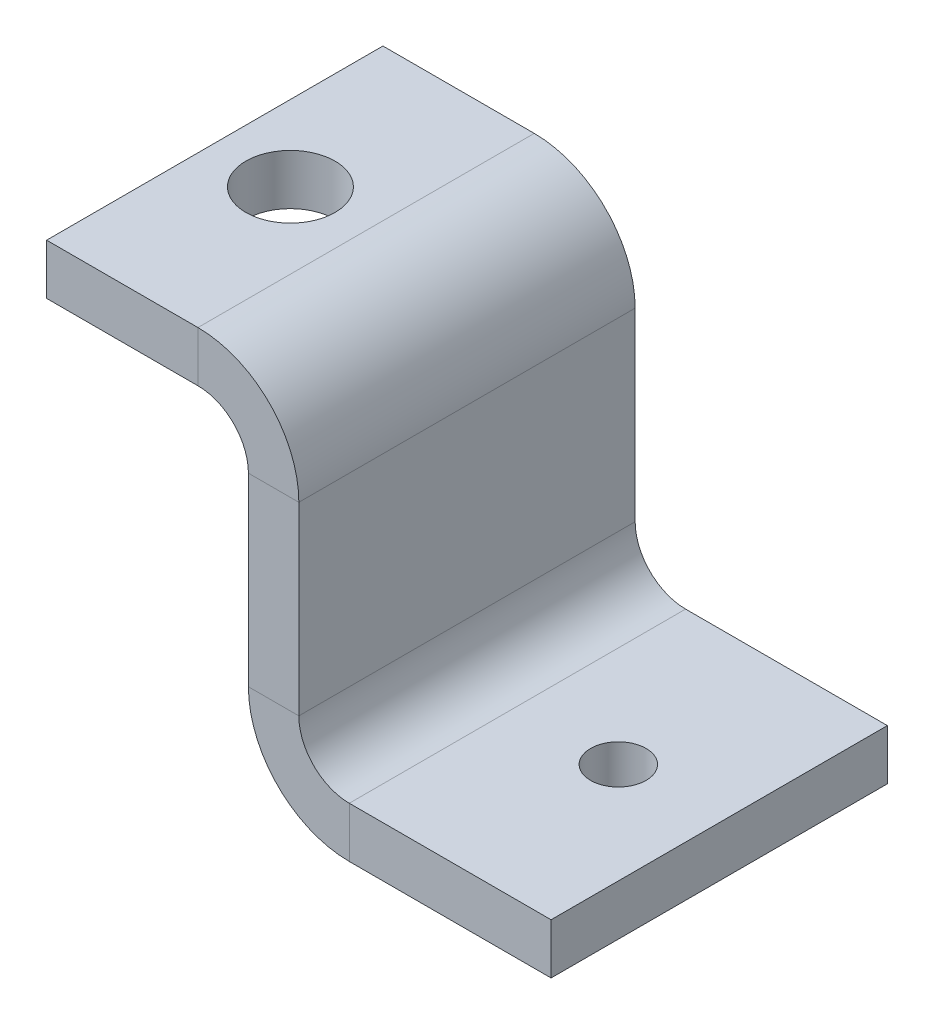
ISO-10303-21;
HEADER;
FILE_DESCRIPTION(('STEP AP214'),'2;1');
FILE_NAME('part.step','',(''),(''),'','','');
FILE_SCHEMA(('AUTOMOTIVE_DESIGN { 1 0 10303 214 1 1 1 1 }'));
ENDSEC;
DATA;
#1=APPLICATION_CONTEXT('core data for automotive mechanical design processes');
#2=APPLICATION_PROTOCOL_DEFINITION('international standard','automotive_design',2000,#1);
#3=PRODUCT_CONTEXT('',#1,'mechanical');
#4=PRODUCT('Part','Part','',(#3));
#5=PRODUCT_RELATED_PRODUCT_CATEGORY('part','',(#4));
#6=PRODUCT_DEFINITION_FORMATION('','',#4);
#7=PRODUCT_DEFINITION_CONTEXT('part definition',#1,'design');
#8=PRODUCT_DEFINITION('design','',#6,#7);
#9=PRODUCT_DEFINITION_SHAPE('','',#8);
#10=(LENGTH_UNIT() NAMED_UNIT(*) SI_UNIT(.MILLI.,.METRE.));
#11=(NAMED_UNIT(*) PLANE_ANGLE_UNIT() SI_UNIT($,.RADIAN.));
#12=(NAMED_UNIT(*) SI_UNIT($,.STERADIAN.) SOLID_ANGLE_UNIT());
#13=UNCERTAINTY_MEASURE_WITH_UNIT(LENGTH_MEASURE(1.E-05),#10,'distance_accuracy_value','');
#14=(GEOMETRIC_REPRESENTATION_CONTEXT(3) GLOBAL_UNCERTAINTY_ASSIGNED_CONTEXT((#13)) GLOBAL_UNIT_ASSIGNED_CONTEXT((#10,
#11,#12)) REPRESENTATION_CONTEXT('',''));
#15=CARTESIAN_POINT('',(0.,0.,0.));
#16=DIRECTION('',(0.,0.,1.));
#17=DIRECTION('',(1.,0.,0.));
#18=AXIS2_PLACEMENT_3D('',#15,#16,#17);
#19=CARTESIAN_POINT('',(-0.568720379146924,14.,20.));
#20=DIRECTION('',(0.,0.,1.));
#21=DIRECTION('',(1.,0.,0.));
#22=AXIS2_PLACEMENT_3D('',#19,#20,#21);
#23=PLANE('',#22);
#24=DIRECTION('',(-1.,0.,0.));
#25=VECTOR('',#24,1.);
#26=CARTESIAN_POINT('',(-0.568720379146924,14.,20.));
#27=LINE('',#26,#25);
#28=CARTESIAN_POINT('',(-0.568720379146924,14.,20.));
#29=VERTEX_POINT('',#28);
#30=CARTESIAN_POINT('',(-3.56872037914692,14.,20.));
#31=VERTEX_POINT('',#30);
#32=EDGE_CURVE('E11',#29,#31,#27,.T.);
#33=ORIENTED_EDGE('',*,*,#32,.F.);
#34=CARTESIAN_POINT('',(-6.56872037914692,14.,20.));
#35=DIRECTION('',(0.,0.,1.));
#36=DIRECTION('',(1.,0.,0.));
#37=AXIS2_PLACEMENT_3D('',#34,#35,#36);
#38=CIRCLE('',#37,6.);
#39=CARTESIAN_POINT('',(-6.56872037914692,20.,20.));
#40=VERTEX_POINT('',#39);
#41=EDGE_CURVE('E288',#40,#29,#38,.F.);
#42=ORIENTED_EDGE('',*,*,#41,.F.);
#43=DIRECTION('',(0.,1.,0.));
#44=VECTOR('',#43,1.);
#45=CARTESIAN_POINT('',(-6.56872037914692,17.,20.));
#46=LINE('',#45,#44);
#47=CARTESIAN_POINT('',(-6.56872037914692,17.,20.));
#48=VERTEX_POINT('',#47);
#49=EDGE_CURVE('E50',#48,#40,#46,.T.);
#50=ORIENTED_EDGE('',*,*,#49,.F.);
#51=CARTESIAN_POINT('',(-6.56872037914692,14.,20.));
#52=DIRECTION('',(0.,0.,1.));
#53=DIRECTION('',(1.,0.,0.));
#54=AXIS2_PLACEMENT_3D('',#51,#52,#53);
#55=CIRCLE('',#54,3.);
#56=EDGE_CURVE('E151',#48,#31,#55,.F.);
#57=ORIENTED_EDGE('',*,*,#56,.T.);
#58=EDGE_LOOP('',(#33,#42,#50,#57));
#59=FACE_BOUND('',#58,.T.);
#60=ADVANCED_FACE('F40',(#59),#23,.T.);
#61=CARTESIAN_POINT('',(-6.56872037914692,17.,20.));
#62=DIRECTION('',(0.,0.,1.));
#63=DIRECTION('',(1.,0.,0.));
#64=AXIS2_PLACEMENT_3D('',#61,#62,#63);
#65=PLANE('',#64);
#66=DIRECTION('',(0.,-1.,0.));
#67=VECTOR('',#66,1.);
#68=CARTESIAN_POINT('',(-0.568720379146924,20.,20.));
#69=LINE('',#68,#67);
#70=CARTESIAN_POINT('',(-0.568720379146922,3.,20.));
#71=VERTEX_POINT('',#70);
#72=EDGE_CURVE('E145',#29,#71,#69,.T.);
#73=ORIENTED_EDGE('',*,*,#72,.F.);
#74=ORIENTED_EDGE('',*,*,#32,.T.);
#75=DIRECTION('',(0.,-1.,0.));
#76=VECTOR('',#75,1.);
#77=CARTESIAN_POINT('',(-3.56872037914692,20.,20.));
#78=LINE('',#77,#76);
#79=CARTESIAN_POINT('',(-3.56872037914692,3.,20.));
#80=VERTEX_POINT('',#79);
#81=EDGE_CURVE('E142',#31,#80,#78,.T.);
#82=ORIENTED_EDGE('',*,*,#81,.T.);
#83=DIRECTION('',(1.,0.,0.));
#84=VECTOR('',#83,1.);
#85=CARTESIAN_POINT('',(-3.56872037914692,3.,20.));
#86=LINE('',#85,#84);
#87=EDGE_CURVE('E262',#80,#71,#86,.T.);
#88=ORIENTED_EDGE('',*,*,#87,.T.);
#89=EDGE_LOOP('',(#73,#74,#82,#88));
#90=FACE_BOUND('',#89,.T.);
#91=ADVANCED_FACE('F140',(#90),#65,.T.);
#92=CARTESIAN_POINT('',(-6.56872037914692,20.,0.));
#93=DIRECTION('',(0.,0.,-1.));
#94=DIRECTION('',(-1.,0.,0.));
#95=AXIS2_PLACEMENT_3D('',#92,#93,#94);
#96=PLANE('',#95);
#97=DIRECTION('',(0.,-1.,0.));
#98=VECTOR('',#97,1.);
#99=CARTESIAN_POINT('',(-6.56872037914692,20.,0.));
#100=LINE('',#99,#98);
#101=CARTESIAN_POINT('',(-6.56872037914692,20.,0.));
#102=VERTEX_POINT('',#101);
#103=CARTESIAN_POINT('',(-6.56872037914692,17.,0.));
#104=VERTEX_POINT('',#103);
#105=EDGE_CURVE('E270',#102,#104,#100,.T.);
#106=ORIENTED_EDGE('',*,*,#105,.F.);
#107=CARTESIAN_POINT('',(-6.56872037914692,14.,0.));
#108=DIRECTION('',(0.,0.,1.));
#109=DIRECTION('',(1.,0.,0.));
#110=AXIS2_PLACEMENT_3D('',#107,#108,#109);
#111=CIRCLE('',#110,6.);
#112=CARTESIAN_POINT('',(-0.568720379146924,14.,0.));
#113=VERTEX_POINT('',#112);
#114=EDGE_CURVE('E200',#102,#113,#111,.F.);
#115=ORIENTED_EDGE('',*,*,#114,.T.);
#116=DIRECTION('',(1.,0.,0.));
#117=VECTOR('',#116,1.);
#118=CARTESIAN_POINT('',(-3.56872037914692,14.,0.));
#119=LINE('',#118,#117);
#120=CARTESIAN_POINT('',(-3.56872037914692,14.,0.));
#121=VERTEX_POINT('',#120);
#122=EDGE_CURVE('E267',#121,#113,#119,.T.);
#123=ORIENTED_EDGE('',*,*,#122,.F.);
#124=CARTESIAN_POINT('',(-6.56872037914692,14.,0.));
#125=DIRECTION('',(0.,0.,1.));
#126=DIRECTION('',(1.,0.,0.));
#127=AXIS2_PLACEMENT_3D('',#124,#125,#126);
#128=CIRCLE('',#127,3.);
#129=EDGE_CURVE('E164',#104,#121,#128,.F.);
#130=ORIENTED_EDGE('',*,*,#129,.F.);
#131=EDGE_LOOP('',(#106,#115,#123,#130));
#132=FACE_BOUND('',#131,.T.);
#133=ADVANCED_FACE('F352',(#132),#96,.T.);
#134=CARTESIAN_POINT('',(-3.56872037914692,14.,0.));
#135=DIRECTION('',(0.,0.,-1.));
#136=DIRECTION('',(-1.,0.,0.));
#137=AXIS2_PLACEMENT_3D('',#134,#135,#136);
#138=PLANE('',#137);
#139=DIRECTION('',(1.,0.,0.));
#140=VECTOR('',#139,1.);
#141=CARTESIAN_POINT('',(-15.5687203791469,20.,0.));
#142=LINE('',#141,#140);
#143=CARTESIAN_POINT('',(-15.5687203791469,20.,0.));
#144=VERTEX_POINT('',#143);
#145=EDGE_CURVE('E203',#144,#102,#142,.T.);
#146=ORIENTED_EDGE('',*,*,#145,.T.);
#147=ORIENTED_EDGE('',*,*,#105,.T.);
#148=DIRECTION('',(1.,0.,0.));
#149=VECTOR('',#148,1.);
#150=CARTESIAN_POINT('',(-15.5687203791469,17.,0.));
#151=LINE('',#150,#149);
#152=CARTESIAN_POINT('',(-15.5687203791469,17.,0.));
#153=VERTEX_POINT('',#152);
#154=EDGE_CURVE('E211',#153,#104,#151,.T.);
#155=ORIENTED_EDGE('',*,*,#154,.F.);
#156=DIRECTION('',(0.,1.,0.));
#157=VECTOR('',#156,1.);
#158=CARTESIAN_POINT('',(-15.5687203791469,17.,0.));
#159=LINE('',#158,#157);
#160=EDGE_CURVE('E207',#153,#144,#159,.T.);
#161=ORIENTED_EDGE('',*,*,#160,.T.);
#162=EDGE_LOOP('',(#146,#147,#155,#161));
#163=FACE_BOUND('',#162,.T.);
#164=ADVANCED_FACE('F355',(#163),#138,.T.);
#165=CARTESIAN_POINT('',(2.43127962085308,0.,20.));
#166=DIRECTION('',(0.,0.,1.));
#167=DIRECTION('',(1.,0.,0.));
#168=AXIS2_PLACEMENT_3D('',#165,#166,#167);
#169=PLANE('',#168);
#170=DIRECTION('',(0.,-1.,0.));
#171=VECTOR('',#170,1.);
#172=CARTESIAN_POINT('',(2.43127962085308,0.,20.));
#173=LINE('',#172,#171);
#174=CARTESIAN_POINT('',(2.43127962085308,0.,20.));
#175=VERTEX_POINT('',#174);
#176=CARTESIAN_POINT('',(2.43127962085308,-3.,20.));
#177=VERTEX_POINT('',#176);
#178=EDGE_CURVE('E58',#175,#177,#173,.T.);
#179=ORIENTED_EDGE('',*,*,#178,.F.);
#180=CARTESIAN_POINT('',(2.43127962085308,3.,20.));
#181=DIRECTION('',(0.,0.,-1.));
#182=DIRECTION('',(-1.,0.,0.));
#183=AXIS2_PLACEMENT_3D('',#180,#181,#182);
#184=CIRCLE('',#183,3.);
#185=EDGE_CURVE('E301',#71,#175,#184,.F.);
#186=ORIENTED_EDGE('',*,*,#185,.F.);
#187=ORIENTED_EDGE('',*,*,#87,.F.);
#188=CARTESIAN_POINT('',(2.43127962085308,3.,20.));
#189=DIRECTION('',(0.,0.,1.));
#190=DIRECTION('',(1.,0.,0.));
#191=AXIS2_PLACEMENT_3D('',#188,#189,#190);
#192=CIRCLE('',#191,6.);
#193=EDGE_CURVE('E174',#80,#177,#192,.T.);
#194=ORIENTED_EDGE('',*,*,#193,.T.);
#195=EDGE_LOOP('',(#179,#186,#187,#194));
#196=FACE_BOUND('',#195,.T.);
#197=ADVANCED_FACE('F382',(#196),#169,.T.);
#198=CARTESIAN_POINT('',(-3.56872037914692,3.,20.));
#199=DIRECTION('',(0.,0.,1.));
#200=DIRECTION('',(1.,0.,0.));
#201=AXIS2_PLACEMENT_3D('',#198,#199,#200);
#202=PLANE('',#201);
#203=DIRECTION('',(1.,0.,0.));
#204=VECTOR('',#203,1.);
#205=CARTESIAN_POINT('',(-0.568720379146922,0.,20.));
#206=LINE('',#205,#204);
#207=CARTESIAN_POINT('',(14.4312796208531,0.,20.));
#208=VERTEX_POINT('',#207);
#209=EDGE_CURVE('E303',#175,#208,#206,.T.);
#210=ORIENTED_EDGE('',*,*,#209,.F.);
#211=ORIENTED_EDGE('',*,*,#178,.T.);
#212=DIRECTION('',(1.,0.,0.));
#213=VECTOR('',#212,1.);
#214=CARTESIAN_POINT('',(-0.568720379146922,-3.,20.));
#215=LINE('',#214,#213);
#216=CARTESIAN_POINT('',(14.4312796208531,-3.,20.));
#217=VERTEX_POINT('',#216);
#218=EDGE_CURVE('E112',#177,#217,#215,.T.);
#219=ORIENTED_EDGE('',*,*,#218,.T.);
#220=DIRECTION('',(0.,-1.,0.));
#221=VECTOR('',#220,1.);
#222=CARTESIAN_POINT('',(14.4312796208531,0.,20.));
#223=LINE('',#222,#221);
#224=EDGE_CURVE('E311',#208,#217,#223,.T.);
#225=ORIENTED_EDGE('',*,*,#224,.F.);
#226=EDGE_LOOP('',(#210,#211,#219,#225));
#227=FACE_BOUND('',#226,.T.);
#228=ADVANCED_FACE('F385',(#227),#202,.T.);
#229=CARTESIAN_POINT('',(-0.568720379146922,3.,0.));
#230=DIRECTION('',(0.,0.,-1.));
#231=DIRECTION('',(-1.,0.,0.));
#232=AXIS2_PLACEMENT_3D('',#229,#230,#231);
#233=PLANE('',#232);
#234=DIRECTION('',(-1.,0.,0.));
#235=VECTOR('',#234,1.);
#236=CARTESIAN_POINT('',(-0.568720379146922,3.,0.));
#237=LINE('',#236,#235);
#238=CARTESIAN_POINT('',(-0.568720379146922,3.,0.));
#239=VERTEX_POINT('',#238);
#240=CARTESIAN_POINT('',(-3.56872037914692,3.,0.));
#241=VERTEX_POINT('',#240);
#242=EDGE_CURVE('E99',#239,#241,#237,.T.);
#243=ORIENTED_EDGE('',*,*,#242,.F.);
#244=CARTESIAN_POINT('',(2.43127962085308,3.,0.));
#245=DIRECTION('',(0.,0.,-1.));
#246=DIRECTION('',(-1.,0.,0.));
#247=AXIS2_PLACEMENT_3D('',#244,#245,#246);
#248=CIRCLE('',#247,3.);
#249=CARTESIAN_POINT('',(2.43127962085308,0.,0.));
#250=VERTEX_POINT('',#249);
#251=EDGE_CURVE('E194',#239,#250,#248,.F.);
#252=ORIENTED_EDGE('',*,*,#251,.T.);
#253=DIRECTION('',(0.,1.,0.));
#254=VECTOR('',#253,1.);
#255=CARTESIAN_POINT('',(2.43127962085308,-3.,0.));
#256=LINE('',#255,#254);
#257=CARTESIAN_POINT('',(2.43127962085308,-3.,0.));
#258=VERTEX_POINT('',#257);
#259=EDGE_CURVE('E106',#258,#250,#256,.T.);
#260=ORIENTED_EDGE('',*,*,#259,.F.);
#261=CARTESIAN_POINT('',(2.43127962085308,3.,0.));
#262=DIRECTION('',(0.,0.,1.));
#263=DIRECTION('',(1.,0.,0.));
#264=AXIS2_PLACEMENT_3D('',#261,#262,#263);
#265=CIRCLE('',#264,6.);
#266=EDGE_CURVE('E220',#241,#258,#265,.T.);
#267=ORIENTED_EDGE('',*,*,#266,.F.);
#268=EDGE_LOOP('',(#243,#252,#260,#267));
#269=FACE_BOUND('',#268,.T.);
#270=ADVANCED_FACE('F346',(#269),#233,.T.);
#271=CARTESIAN_POINT('',(2.43127962085308,-3.,0.));
#272=DIRECTION('',(0.,0.,-1.));
#273=DIRECTION('',(-1.,0.,0.));
#274=AXIS2_PLACEMENT_3D('',#271,#272,#273);
#275=PLANE('',#274);
#276=DIRECTION('',(0.,-1.,0.));
#277=VECTOR('',#276,1.);
#278=CARTESIAN_POINT('',(-0.568720379146924,20.,0.));
#279=LINE('',#278,#277);
#280=EDGE_CURVE('E197',#113,#239,#279,.T.);
#281=ORIENTED_EDGE('',*,*,#280,.T.);
#282=ORIENTED_EDGE('',*,*,#242,.T.);
#283=DIRECTION('',(0.,-1.,0.));
#284=VECTOR('',#283,1.);
#285=CARTESIAN_POINT('',(-3.56872037914692,20.,0.));
#286=LINE('',#285,#284);
#287=EDGE_CURVE('E217',#121,#241,#286,.T.);
#288=ORIENTED_EDGE('',*,*,#287,.F.);
#289=ORIENTED_EDGE('',*,*,#122,.T.);
#290=EDGE_LOOP('',(#281,#282,#288,#289));
#291=FACE_BOUND('',#290,.T.);
#292=ADVANCED_FACE('F348',(#291),#275,.T.);
#293=CARTESIAN_POINT('',(-0.568720379146922,-3.,20.));
#294=DIRECTION('',(0.,1.,0.));
#295=DIRECTION('',(0.,0.,1.));
#296=AXIS2_PLACEMENT_3D('',#293,#294,#295);
#297=PLANE('',#296);
#298=CARTESIAN_POINT('',(8.43127962085308,-3.,10.));
#299=DIRECTION('',(0.,1.,0.));
#300=DIRECTION('',(0.,0.,1.));
#301=AXIS2_PLACEMENT_3D('',#298,#299,#300);
#302=CIRCLE('',#301,1.65);
#303=CARTESIAN_POINT('',(8.43127962085308,-3.,11.65));
#304=VERTEX_POINT('',#303);
#305=EDGE_CURVE('E323',#304,#304,#302,.T.);
#306=ORIENTED_EDGE('',*,*,#305,.T.);
#307=EDGE_LOOP('',(#306));
#308=FACE_BOUND('',#307,.T.);
#309=DIRECTION('',(1.,0.,0.));
#310=VECTOR('',#309,1.);
#311=CARTESIAN_POINT('',(-0.568720379146922,-3.,0.));
#312=LINE('',#311,#310);
#313=CARTESIAN_POINT('',(14.4312796208531,-3.,0.));
#314=VERTEX_POINT('',#313);
#315=EDGE_CURVE('E182',#258,#314,#312,.T.);
#316=ORIENTED_EDGE('',*,*,#315,.T.);
#317=DIRECTION('',(0.,0.,-1.));
#318=VECTOR('',#317,1.);
#319=CARTESIAN_POINT('',(14.4312796208531,-3.,20.));
#320=LINE('',#319,#318);
#321=EDGE_CURVE('E255',#217,#314,#320,.T.);
#322=ORIENTED_EDGE('',*,*,#321,.F.);
#323=ORIENTED_EDGE('',*,*,#218,.F.);
#324=DIRECTION('',(0.,0.,-1.));
#325=VECTOR('',#324,1.);
#326=CARTESIAN_POINT('',(2.43127962085308,-3.,20.));
#327=LINE('',#326,#325);
#328=EDGE_CURVE('E178',#177,#258,#327,.T.);
#329=ORIENTED_EDGE('',*,*,#328,.T.);
#330=EDGE_LOOP('',(#316,#322,#323,#329));
#331=FACE_BOUND('',#330,.T.);
#332=ADVANCED_FACE('F393',(#308,#331),#297,.F.);
#333=CARTESIAN_POINT('',(14.4312796208531,0.,20.));
#334=DIRECTION('',(1.,0.,0.));
#335=DIRECTION('',(0.,0.,-1.));
#336=AXIS2_PLACEMENT_3D('',#333,#334,#335);
#337=PLANE('',#336);
#338=DIRECTION('',(0.,-1.,0.));
#339=VECTOR('',#338,1.);
#340=CARTESIAN_POINT('',(14.4312796208531,0.,0.));
#341=LINE('',#340,#339);
#342=CARTESIAN_POINT('',(14.4312796208531,0.,0.));
#343=VERTEX_POINT('',#342);
#344=EDGE_CURVE('E186',#343,#314,#341,.T.);
#345=ORIENTED_EDGE('',*,*,#344,.F.);
#346=DIRECTION('',(0.,0.,-1.));
#347=VECTOR('',#346,1.);
#348=CARTESIAN_POINT('',(14.4312796208531,0.,20.));
#349=LINE('',#348,#347);
#350=EDGE_CURVE('E252',#208,#343,#349,.T.);
#351=ORIENTED_EDGE('',*,*,#350,.F.);
#352=ORIENTED_EDGE('',*,*,#224,.T.);
#353=ORIENTED_EDGE('',*,*,#321,.T.);
#354=EDGE_LOOP('',(#345,#351,#352,#353));
#355=FACE_BOUND('',#354,.T.);
#356=ADVANCED_FACE('F339',(#355),#337,.T.);
#357=CARTESIAN_POINT('',(-0.568720379146922,0.,20.));
#358=DIRECTION('',(0.,1.,0.));
#359=DIRECTION('',(0.,0.,1.));
#360=AXIS2_PLACEMENT_3D('',#357,#358,#359);
#361=PLANE('',#360);
#362=CARTESIAN_POINT('',(8.43127962085308,0.,10.));
#363=DIRECTION('',(0.,1.,0.));
#364=DIRECTION('',(0.,0.,1.));
#365=AXIS2_PLACEMENT_3D('',#362,#363,#364);
#366=CIRCLE('',#365,1.65);
#367=CARTESIAN_POINT('',(8.43127962085308,0.,11.65));
#368=VERTEX_POINT('',#367);
#369=EDGE_CURVE('E327',#368,#368,#366,.T.);
#370=ORIENTED_EDGE('',*,*,#369,.F.);
#371=EDGE_LOOP('',(#370));
#372=FACE_BOUND('',#371,.T.);
#373=DIRECTION('',(1.,0.,0.));
#374=VECTOR('',#373,1.);
#375=CARTESIAN_POINT('',(-0.568720379146922,0.,0.));
#376=LINE('',#375,#374);
#377=EDGE_CURVE('E190',#250,#343,#376,.T.);
#378=ORIENTED_EDGE('',*,*,#377,.F.);
#379=DIRECTION('',(0.,0.,-1.));
#380=VECTOR('',#379,1.);
#381=CARTESIAN_POINT('',(2.43127962085308,0.,20.));
#382=LINE('',#381,#380);
#383=EDGE_CURVE('E248',#175,#250,#382,.T.);
#384=ORIENTED_EDGE('',*,*,#383,.F.);
#385=ORIENTED_EDGE('',*,*,#209,.T.);
#386=ORIENTED_EDGE('',*,*,#350,.T.);
#387=EDGE_LOOP('',(#378,#384,#385,#386));
#388=FACE_BOUND('',#387,.T.);
#389=ADVANCED_FACE('F335',(#372,#388),#361,.T.);
#390=CARTESIAN_POINT('',(2.43127962085308,3.,20.));
#391=DIRECTION('',(0.,0.,-1.));
#392=DIRECTION('',(-1.,0.,0.));
#393=AXIS2_PLACEMENT_3D('',#390,#391,#392);
#394=CYLINDRICAL_SURFACE('',#393,3.);
#395=ORIENTED_EDGE('',*,*,#251,.F.);
#396=DIRECTION('',(0.,0.,-1.));
#397=VECTOR('',#396,1.);
#398=CARTESIAN_POINT('',(-0.568720379146922,3.,20.));
#399=LINE('',#398,#397);
#400=EDGE_CURVE('E244',#71,#239,#399,.T.);
#401=ORIENTED_EDGE('',*,*,#400,.F.);
#402=ORIENTED_EDGE('',*,*,#185,.T.);
#403=ORIENTED_EDGE('',*,*,#383,.T.);
#404=EDGE_LOOP('',(#395,#401,#402,#403));
#405=FACE_BOUND('',#404,.T.);
#406=ADVANCED_FACE('F338',(#405),#394,.F.);
#407=CARTESIAN_POINT('',(-0.568720379146924,20.,20.));
#408=DIRECTION('',(1.,0.,0.));
#409=DIRECTION('',(0.,1.,0.));
#410=AXIS2_PLACEMENT_3D('',#407,#408,#409);
#411=PLANE('',#410);
#412=ORIENTED_EDGE('',*,*,#280,.F.);
#413=DIRECTION('',(0.,0.,-1.));
#414=VECTOR('',#413,1.);
#415=CARTESIAN_POINT('',(-0.568720379146924,14.,20.));
#416=LINE('',#415,#414);
#417=EDGE_CURVE('E240',#29,#113,#416,.T.);
#418=ORIENTED_EDGE('',*,*,#417,.F.);
#419=ORIENTED_EDGE('',*,*,#72,.T.);
#420=ORIENTED_EDGE('',*,*,#400,.T.);
#421=EDGE_LOOP('',(#412,#418,#419,#420));
#422=FACE_BOUND('',#421,.T.);
#423=ADVANCED_FACE('F350',(#422),#411,.T.);
#424=CARTESIAN_POINT('',(-6.56872037914692,14.,20.));
#425=DIRECTION('',(0.,0.,-1.));
#426=DIRECTION('',(-1.,0.,0.));
#427=AXIS2_PLACEMENT_3D('',#424,#425,#426);
#428=CYLINDRICAL_SURFACE('',#427,6.);
#429=ORIENTED_EDGE('',*,*,#114,.F.);
#430=DIRECTION('',(0.,0.,-1.));
#431=VECTOR('',#430,1.);
#432=CARTESIAN_POINT('',(-6.56872037914692,20.,20.));
#433=LINE('',#432,#431);
#434=EDGE_CURVE('E236',#40,#102,#433,.T.);
#435=ORIENTED_EDGE('',*,*,#434,.F.);
#436=ORIENTED_EDGE('',*,*,#41,.T.);
#437=ORIENTED_EDGE('',*,*,#417,.T.);
#438=EDGE_LOOP('',(#429,#435,#436,#437));
#439=FACE_BOUND('',#438,.T.);
#440=ADVANCED_FACE('F287',(#439),#428,.T.);
#441=CARTESIAN_POINT('',(-15.5687203791469,20.,20.));
#442=DIRECTION('',(0.,1.,0.));
#443=DIRECTION('',(0.,0.,1.));
#444=AXIS2_PLACEMENT_3D('',#441,#442,#443);
#445=PLANE('',#444);
#446=CARTESIAN_POINT('',(-11.0687203791469,20.,10.));
#447=DIRECTION('',(0.,1.,0.));
#448=DIRECTION('',(0.,0.,1.));
#449=AXIS2_PLACEMENT_3D('',#446,#447,#448);
#450=CIRCLE('',#449,2.65);
#451=CARTESIAN_POINT('',(-11.0687203791469,20.,12.65));
#452=VERTEX_POINT('',#451);
#453=EDGE_CURVE('E319',#452,#452,#450,.T.);
#454=ORIENTED_EDGE('',*,*,#453,.F.);
#455=EDGE_LOOP('',(#454));
#456=FACE_BOUND('',#455,.T.);
#457=ORIENTED_EDGE('',*,*,#145,.F.);
#458=DIRECTION('',(0.,0.,-1.));
#459=VECTOR('',#458,1.);
#460=CARTESIAN_POINT('',(-15.5687203791469,20.,20.));
#461=LINE('',#460,#459);
#462=CARTESIAN_POINT('',(-15.5687203791469,20.,20.));
#463=VERTEX_POINT('',#462);
#464=EDGE_CURVE('E233',#463,#144,#461,.T.);
#465=ORIENTED_EDGE('',*,*,#464,.F.);
#466=DIRECTION('',(1.,0.,0.));
#467=VECTOR('',#466,1.);
#468=CARTESIAN_POINT('',(-15.5687203791469,20.,20.));
#469=LINE('',#468,#467);
#470=EDGE_CURVE('E281',#463,#40,#469,.T.);
#471=ORIENTED_EDGE('',*,*,#470,.T.);
#472=ORIENTED_EDGE('',*,*,#434,.T.);
#473=EDGE_LOOP('',(#457,#465,#471,#472));
#474=FACE_BOUND('',#473,.T.);
#475=ADVANCED_FACE('F293',(#456,#474),#445,.T.);
#476=CARTESIAN_POINT('',(-15.5687203791469,17.,20.));
#477=DIRECTION('',(-1.,0.,0.));
#478=DIRECTION('',(0.,0.,1.));
#479=AXIS2_PLACEMENT_3D('',#476,#477,#478);
#480=PLANE('',#479);
#481=ORIENTED_EDGE('',*,*,#160,.F.);
#482=DIRECTION('',(0.,0.,-1.));
#483=VECTOR('',#482,1.);
#484=CARTESIAN_POINT('',(-15.5687203791469,17.,20.));
#485=LINE('',#484,#483);
#486=CARTESIAN_POINT('',(-15.5687203791469,17.,20.));
#487=VERTEX_POINT('',#486);
#488=EDGE_CURVE('E230',#487,#153,#485,.T.);
#489=ORIENTED_EDGE('',*,*,#488,.F.);
#490=DIRECTION('',(0.,1.,0.));
#491=VECTOR('',#490,1.);
#492=CARTESIAN_POINT('',(-15.5687203791469,17.,20.));
#493=LINE('',#492,#491);
#494=EDGE_CURVE('E295',#487,#463,#493,.T.);
#495=ORIENTED_EDGE('',*,*,#494,.T.);
#496=ORIENTED_EDGE('',*,*,#464,.T.);
#497=EDGE_LOOP('',(#481,#489,#495,#496));
#498=FACE_BOUND('',#497,.T.);
#499=ADVANCED_FACE('F360',(#498),#480,.T.);
#500=CARTESIAN_POINT('',(-15.5687203791469,17.,20.));
#501=DIRECTION('',(0.,1.,0.));
#502=DIRECTION('',(0.,0.,1.));
#503=AXIS2_PLACEMENT_3D('',#500,#501,#502);
#504=PLANE('',#503);
#505=CARTESIAN_POINT('',(-11.0687203791469,17.,10.));
#506=DIRECTION('',(0.,1.,0.));
#507=DIRECTION('',(0.,0.,1.));
#508=AXIS2_PLACEMENT_3D('',#505,#506,#507);
#509=CIRCLE('',#508,2.65);
#510=CARTESIAN_POINT('',(-11.0687203791469,17.,12.65));
#511=VERTEX_POINT('',#510);
#512=EDGE_CURVE('E43',#511,#511,#509,.T.);
#513=ORIENTED_EDGE('',*,*,#512,.T.);
#514=EDGE_LOOP('',(#513));
#515=FACE_BOUND('',#514,.T.);
#516=ORIENTED_EDGE('',*,*,#154,.T.);
#517=DIRECTION('',(0.,0.,-1.));
#518=VECTOR('',#517,1.);
#519=CARTESIAN_POINT('',(-6.56872037914692,17.,20.));
#520=LINE('',#519,#518);
#521=EDGE_CURVE('E167',#48,#104,#520,.T.);
#522=ORIENTED_EDGE('',*,*,#521,.F.);
#523=DIRECTION('',(1.,0.,0.));
#524=VECTOR('',#523,1.);
#525=CARTESIAN_POINT('',(-15.5687203791469,17.,20.));
#526=LINE('',#525,#524);
#527=EDGE_CURVE('E157',#487,#48,#526,.T.);
#528=ORIENTED_EDGE('',*,*,#527,.F.);
#529=ORIENTED_EDGE('',*,*,#488,.T.);
#530=EDGE_LOOP('',(#516,#522,#528,#529));
#531=FACE_BOUND('',#530,.T.);
#532=ADVANCED_FACE('F358',(#515,#531),#504,.F.);
#533=CARTESIAN_POINT('',(-6.56872037914692,14.,20.));
#534=DIRECTION('',(0.,0.,-1.));
#535=DIRECTION('',(-1.,0.,0.));
#536=AXIS2_PLACEMENT_3D('',#533,#534,#535);
#537=CYLINDRICAL_SURFACE('',#536,3.);
#538=ORIENTED_EDGE('',*,*,#129,.T.);
#539=DIRECTION('',(0.,0.,-1.));
#540=VECTOR('',#539,1.);
#541=CARTESIAN_POINT('',(-3.56872037914692,14.,20.));
#542=LINE('',#541,#540);
#543=EDGE_CURVE('E161',#31,#121,#542,.T.);
#544=ORIENTED_EDGE('',*,*,#543,.F.);
#545=ORIENTED_EDGE('',*,*,#56,.F.);
#546=ORIENTED_EDGE('',*,*,#521,.T.);
#547=EDGE_LOOP('',(#538,#544,#545,#546));
#548=FACE_BOUND('',#547,.T.);
#549=ADVANCED_FACE('F162',(#548),#537,.F.);
#550=CARTESIAN_POINT('',(-3.56872037914692,20.,20.));
#551=DIRECTION('',(1.,0.,0.));
#552=DIRECTION('',(0.,1.,0.));
#553=AXIS2_PLACEMENT_3D('',#550,#551,#552);
#554=PLANE('',#553);
#555=ORIENTED_EDGE('',*,*,#287,.T.);
#556=DIRECTION('',(0.,0.,-1.));
#557=VECTOR('',#556,1.);
#558=CARTESIAN_POINT('',(-3.56872037914692,3.,20.));
#559=LINE('',#558,#557);
#560=EDGE_CURVE('E168',#80,#241,#559,.T.);
#561=ORIENTED_EDGE('',*,*,#560,.F.);
#562=ORIENTED_EDGE('',*,*,#81,.F.);
#563=ORIENTED_EDGE('',*,*,#543,.T.);
#564=EDGE_LOOP('',(#555,#561,#562,#563));
#565=FACE_BOUND('',#564,.T.);
#566=ADVANCED_FACE('F170',(#565),#554,.F.);
#567=CARTESIAN_POINT('',(2.43127962085308,3.,20.));
#568=DIRECTION('',(0.,0.,-1.));
#569=DIRECTION('',(-1.,0.,0.));
#570=AXIS2_PLACEMENT_3D('',#567,#568,#569);
#571=CYLINDRICAL_SURFACE('',#570,6.);
#572=ORIENTED_EDGE('',*,*,#266,.T.);
#573=ORIENTED_EDGE('',*,*,#328,.F.);
#574=ORIENTED_EDGE('',*,*,#193,.F.);
#575=ORIENTED_EDGE('',*,*,#560,.T.);
#576=EDGE_LOOP('',(#572,#573,#574,#575));
#577=FACE_BOUND('',#576,.T.);
#578=ADVANCED_FACE('F436',(#577),#571,.T.);
#579=CARTESIAN_POINT('',(2.43127962085308,3.,20.));
#580=DIRECTION('',(0.,0.,-1.));
#581=DIRECTION('',(-1.,0.,0.));
#582=AXIS2_PLACEMENT_3D('',#579,#580,#581);
#583=PLANE('',#582);
#584=ORIENTED_EDGE('',*,*,#527,.T.);
#585=ORIENTED_EDGE('',*,*,#49,.T.);
#586=ORIENTED_EDGE('',*,*,#470,.F.);
#587=ORIENTED_EDGE('',*,*,#494,.F.);
#588=EDGE_LOOP('',(#584,#585,#586,#587));
#589=FACE_BOUND('',#588,.T.);
#590=ADVANCED_FACE('F278',(#589),#583,.F.);
#591=CARTESIAN_POINT('',(2.43127962085308,3.,0.));
#592=DIRECTION('',(0.,0.,-1.));
#593=DIRECTION('',(-1.,0.,0.));
#594=AXIS2_PLACEMENT_3D('',#591,#592,#593);
#595=PLANE('',#594);
#596=ORIENTED_EDGE('',*,*,#315,.F.);
#597=ORIENTED_EDGE('',*,*,#259,.T.);
#598=ORIENTED_EDGE('',*,*,#377,.T.);
#599=ORIENTED_EDGE('',*,*,#344,.T.);
#600=EDGE_LOOP('',(#596,#597,#598,#599));
#601=FACE_BOUND('',#600,.T.);
#602=ADVANCED_FACE('F452',(#601),#595,.T.);
#603=CARTESIAN_POINT('',(-11.0687203791469,10.,10.));
#604=DIRECTION('',(0.,1.,0.));
#605=DIRECTION('',(0.,0.,1.));
#606=AXIS2_PLACEMENT_3D('',#603,#604,#605);
#607=CYLINDRICAL_SURFACE('',#606,2.65);
#608=ORIENTED_EDGE('',*,*,#453,.T.);
#609=EDGE_LOOP('',(#608));
#610=FACE_BOUND('',#609,.T.);
#611=ORIENTED_EDGE('',*,*,#512,.F.);
#612=EDGE_LOOP('',(#611));
#613=FACE_BOUND('',#612,.T.);
#614=ADVANCED_FACE('F459',(#610,#613),#607,.F.);
#615=CARTESIAN_POINT('',(8.43127962085308,-10.,10.));
#616=DIRECTION('',(0.,1.,0.));
#617=DIRECTION('',(0.,0.,1.));
#618=AXIS2_PLACEMENT_3D('',#615,#616,#617);
#619=CYLINDRICAL_SURFACE('',#618,1.65);
#620=ORIENTED_EDGE('',*,*,#369,.T.);
#621=EDGE_LOOP('',(#620));
#622=FACE_BOUND('',#621,.T.);
#623=ORIENTED_EDGE('',*,*,#305,.F.);
#624=EDGE_LOOP('',(#623));
#625=FACE_BOUND('',#624,.T.);
#626=ADVANCED_FACE('F332',(#622,#625),#619,.F.);
#627=CLOSED_SHELL('',(#60,#91,#133,#164,#197,#228,#270,#292,#332,#356,#389,#406,#423,#440,#475,
#499,#532,#549,#566,#578,#590,#602,#614,#626));
#628=MANIFOLD_SOLID_BREP('B2',#627);
#629=ADVANCED_BREP_SHAPE_REPRESENTATION('',(#18,#628),#14);
#630=SHAPE_DEFINITION_REPRESENTATION(#9,#629);
ENDSEC;
END-ISO-10303-21;
